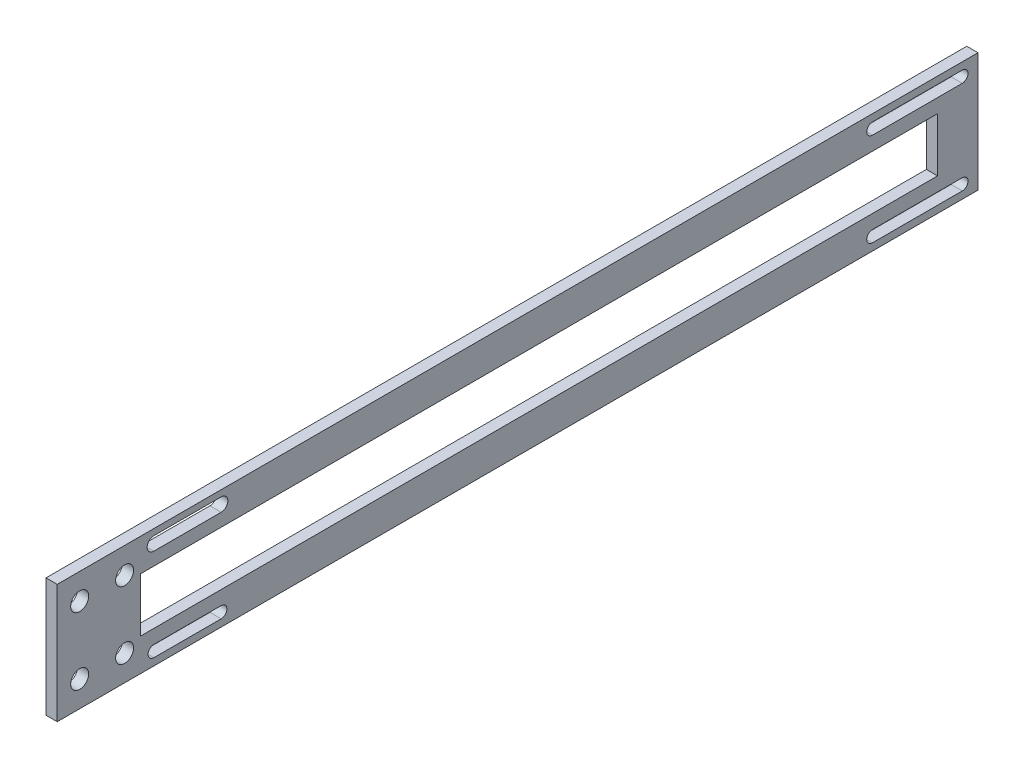
ISO-10303-21;
HEADER;
FILE_DESCRIPTION(('STEP AP214'),'2;1');
FILE_NAME('part.step','',(''),(''),'','','');
FILE_SCHEMA(('AUTOMOTIVE_DESIGN { 1 0 10303 214 1 1 1 1 }'));
ENDSEC;
DATA;
#1=APPLICATION_CONTEXT('core data for automotive mechanical design processes');
#2=APPLICATION_PROTOCOL_DEFINITION('international standard','automotive_design',2000,#1);
#3=PRODUCT_CONTEXT('',#1,'mechanical');
#4=PRODUCT('Part','Part','',(#3));
#5=PRODUCT_RELATED_PRODUCT_CATEGORY('part','',(#4));
#6=PRODUCT_DEFINITION_FORMATION('','',#4);
#7=PRODUCT_DEFINITION_CONTEXT('part definition',#1,'design');
#8=PRODUCT_DEFINITION('design','',#6,#7);
#9=PRODUCT_DEFINITION_SHAPE('','',#8);
#10=(LENGTH_UNIT() NAMED_UNIT(*) SI_UNIT(.MILLI.,.METRE.));
#11=(NAMED_UNIT(*) PLANE_ANGLE_UNIT() SI_UNIT($,.RADIAN.));
#12=(NAMED_UNIT(*) SI_UNIT($,.STERADIAN.) SOLID_ANGLE_UNIT());
#13=UNCERTAINTY_MEASURE_WITH_UNIT(LENGTH_MEASURE(1.E-05),#10,'distance_accuracy_value','');
#14=(GEOMETRIC_REPRESENTATION_CONTEXT(3) GLOBAL_UNCERTAINTY_ASSIGNED_CONTEXT((#13)) GLOBAL_UNIT_ASSIGNED_CONTEXT((#10,
#11,#12)) REPRESENTATION_CONTEXT('',''));
#15=CARTESIAN_POINT('',(0.,0.,0.));
#16=DIRECTION('',(0.,0.,1.));
#17=DIRECTION('',(1.,0.,0.));
#18=AXIS2_PLACEMENT_3D('',#15,#16,#17);
#19=CARTESIAN_POINT('',(-3.29113924050637,53.,-395.443037974684));
#20=DIRECTION('',(1.,0.,0.));
#21=DIRECTION('',(0.,0.,-1.));
#22=AXIS2_PLACEMENT_3D('',#19,#20,#21);
#23=PLANE('',#22);
#24=CARTESIAN_POINT('',(-3.29113924050632,41.5,-15.4430379746836));
#25=DIRECTION('',(1.,0.,0.));
#26=DIRECTION('',(0.,0.,-1.));
#27=AXIS2_PLACEMENT_3D('',#24,#25,#26);
#28=CIRCLE('',#27,4.);
#29=CARTESIAN_POINT('',(-3.29113924050632,41.5,-19.4430379746836));
#30=VERTEX_POINT('',#29);
#31=EDGE_CURVE('E510',#30,#30,#28,.F.);
#32=ORIENTED_EDGE('',*,*,#31,.F.);
#33=EDGE_LOOP('',(#32));
#34=FACE_BOUND('',#33,.T.);
#35=CARTESIAN_POINT('',(-3.29113924050632,11.5,-15.4430379746836));
#36=DIRECTION('',(1.,0.,0.));
#37=DIRECTION('',(0.,0.,-1.));
#38=AXIS2_PLACEMENT_3D('',#35,#36,#37);
#39=CIRCLE('',#38,4.);
#40=CARTESIAN_POINT('',(-3.29113924050632,11.5,-19.4430379746835));
#41=VERTEX_POINT('',#40);
#42=EDGE_CURVE('E516',#41,#41,#39,.F.);
#43=ORIENTED_EDGE('',*,*,#42,.F.);
#44=EDGE_LOOP('',(#43));
#45=FACE_BOUND('',#44,.T.);
#46=CARTESIAN_POINT('',(-3.29113924050632,11.5,4.55696202531645));
#47=DIRECTION('',(1.,0.,0.));
#48=DIRECTION('',(0.,0.,-1.));
#49=AXIS2_PLACEMENT_3D('',#46,#47,#48);
#50=CIRCLE('',#49,4.);
#51=CARTESIAN_POINT('',(-3.29113924050632,11.5,0.556962025316447));
#52=VERTEX_POINT('',#51);
#53=EDGE_CURVE('E522',#52,#52,#50,.F.);
#54=ORIENTED_EDGE('',*,*,#53,.F.);
#55=EDGE_LOOP('',(#54));
#56=FACE_BOUND('',#55,.T.);
#57=CARTESIAN_POINT('',(-3.29113924050632,41.5,4.55696202531645));
#58=DIRECTION('',(1.,0.,0.));
#59=DIRECTION('',(0.,0.,-1.));
#60=AXIS2_PLACEMENT_3D('',#57,#58,#59);
#61=CIRCLE('',#60,4.);
#62=CARTESIAN_POINT('',(-3.29113924050632,41.5,0.556962025316448));
#63=VERTEX_POINT('',#62);
#64=EDGE_CURVE('E514',#63,#63,#61,.F.);
#65=ORIENTED_EDGE('',*,*,#64,.F.);
#66=EDGE_LOOP('',(#65));
#67=FACE_BOUND('',#66,.T.);
#68=DIRECTION('',(0.,0.,-1.));
#69=VECTOR('',#68,1.);
#70=CARTESIAN_POINT('',(-3.29113924050632,38.5,-22.4430379746835));
#71=LINE('',#70,#69);
#72=CARTESIAN_POINT('',(-3.29113924050635,38.5,-22.4430379746835));
#73=VERTEX_POINT('',#72);
#74=CARTESIAN_POINT('',(-3.29113924050637,38.5,-377.443037974684));
#75=VERTEX_POINT('',#74);
#76=EDGE_CURVE('E211',#73,#75,#71,.T.);
#77=ORIENTED_EDGE('',*,*,#76,.F.);
#78=DIRECTION('',(0.,1.,0.));
#79=VECTOR('',#78,1.);
#80=CARTESIAN_POINT('',(-3.29113924050632,26.5,-22.4430379746835));
#81=LINE('',#80,#79);
#82=CARTESIAN_POINT('',(-3.29113924050632,14.5,-22.4430379746835));
#83=VERTEX_POINT('',#82);
#84=EDGE_CURVE('E195',#83,#73,#81,.T.);
#85=ORIENTED_EDGE('',*,*,#84,.F.);
#86=DIRECTION('',(0.,0.,1.));
#87=VECTOR('',#86,1.);
#88=CARTESIAN_POINT('',(-3.29113924050637,14.5,-377.443037974684));
#89=LINE('',#88,#87);
#90=CARTESIAN_POINT('',(-3.29113924050637,14.5,-377.443037974683));
#91=VERTEX_POINT('',#90);
#92=EDGE_CURVE('E203',#91,#83,#89,.T.);
#93=ORIENTED_EDGE('',*,*,#92,.F.);
#94=DIRECTION('',(0.,-1.,0.));
#95=VECTOR('',#94,1.);
#96=CARTESIAN_POINT('',(-3.29113924050637,38.5,-377.443037974684));
#97=LINE('',#96,#95);
#98=EDGE_CURVE('E47',#75,#91,#97,.T.);
#99=ORIENTED_EDGE('',*,*,#98,.F.);
#100=EDGE_LOOP('',(#77,#85,#93,#99));
#101=FACE_BOUND('',#100,.T.);
#102=DIRECTION('',(0.,0.,1.));
#103=VECTOR('',#102,1.);
#104=CARTESIAN_POINT('',(-3.29113924050633,3.2,-58.4430379746835));
#105=LINE('',#104,#103);
#106=CARTESIAN_POINT('',(-3.29113924050633,3.2,-58.4430379746835));
#107=VERTEX_POINT('',#106);
#108=CARTESIAN_POINT('',(-3.29113924050633,3.2,-28.4430379746835));
#109=VERTEX_POINT('',#108);
#110=EDGE_CURVE('E231',#107,#109,#105,.T.);
#111=ORIENTED_EDGE('',*,*,#110,.F.);
#112=CARTESIAN_POINT('',(-3.29113924050633,5.75,-58.4430379746835));
#113=DIRECTION('',(1.,0.,0.));
#114=DIRECTION('',(0.,0.,-1.));
#115=AXIS2_PLACEMENT_3D('',#112,#113,#114);
#116=CIRCLE('',#115,2.55);
#117=CARTESIAN_POINT('',(-3.29113924050633,8.3,-58.4430379746835));
#118=VERTEX_POINT('',#117);
#119=EDGE_CURVE('E235',#118,#107,#116,.F.);
#120=ORIENTED_EDGE('',*,*,#119,.F.);
#121=DIRECTION('',(0.,0.,-1.));
#122=VECTOR('',#121,1.);
#123=CARTESIAN_POINT('',(-3.29113924050633,8.3,-58.4430379746835));
#124=LINE('',#123,#122);
#125=CARTESIAN_POINT('',(-3.29113924050633,8.3,-28.4430379746835));
#126=VERTEX_POINT('',#125);
#127=EDGE_CURVE('E252',#126,#118,#124,.T.);
#128=ORIENTED_EDGE('',*,*,#127,.F.);
#129=CARTESIAN_POINT('',(-3.29113924050633,5.74999999999999,-28.4430379746835));
#130=DIRECTION('',(1.,0.,0.));
#131=DIRECTION('',(0.,0.,-1.));
#132=AXIS2_PLACEMENT_3D('',#129,#130,#131);
#133=CIRCLE('',#132,2.55);
#134=EDGE_CURVE('E229',#109,#126,#133,.F.);
#135=ORIENTED_EDGE('',*,*,#134,.F.);
#136=EDGE_LOOP('',(#111,#120,#128,#135));
#137=FACE_BOUND('',#136,.T.);
#138=DIRECTION('',(0.,0.,-1.));
#139=VECTOR('',#138,1.);
#140=CARTESIAN_POINT('',(-3.29113924050636,49.8,-348.443037974684));
#141=LINE('',#140,#139);
#142=CARTESIAN_POINT('',(-3.29113924050637,49.8,-348.443037974684));
#143=VERTEX_POINT('',#142);
#144=CARTESIAN_POINT('',(-3.29113924050637,49.8,-388.443037974683));
#145=VERTEX_POINT('',#144);
#146=EDGE_CURVE('E264',#143,#145,#141,.T.);
#147=ORIENTED_EDGE('',*,*,#146,.F.);
#148=CARTESIAN_POINT('',(-3.29113924050636,47.25,-348.443037974684));
#149=DIRECTION('',(1.,0.,0.));
#150=DIRECTION('',(0.,0.,-1.));
#151=AXIS2_PLACEMENT_3D('',#148,#149,#150);
#152=CIRCLE('',#151,2.55);
#153=CARTESIAN_POINT('',(-3.29113924050636,44.7,-348.443037974684));
#154=VERTEX_POINT('',#153);
#155=EDGE_CURVE('E268',#154,#143,#152,.F.);
#156=ORIENTED_EDGE('',*,*,#155,.F.);
#157=DIRECTION('',(0.,0.,1.));
#158=VECTOR('',#157,1.);
#159=CARTESIAN_POINT('',(-3.29113924050636,44.7,-348.443037974684));
#160=LINE('',#159,#158);
#161=CARTESIAN_POINT('',(-3.29113924050637,44.7,-388.443037974683));
#162=VERTEX_POINT('',#161);
#163=EDGE_CURVE('E232',#162,#154,#160,.T.);
#164=ORIENTED_EDGE('',*,*,#163,.F.);
#165=CARTESIAN_POINT('',(-3.29113924050637,47.25,-388.443037974683));
#166=DIRECTION('',(1.,0.,0.));
#167=DIRECTION('',(0.,0.,-1.));
#168=AXIS2_PLACEMENT_3D('',#165,#166,#167);
#169=CIRCLE('',#168,2.55);
#170=EDGE_CURVE('E262',#145,#162,#169,.F.);
#171=ORIENTED_EDGE('',*,*,#170,.F.);
#172=EDGE_LOOP('',(#147,#156,#164,#171));
#173=FACE_BOUND('',#172,.T.);
#174=DIRECTION('',(0.,0.,-1.));
#175=VECTOR('',#174,1.);
#176=CARTESIAN_POINT('',(-3.29113924050636,8.3,-348.443037974684));
#177=LINE('',#176,#175);
#178=CARTESIAN_POINT('',(-3.29113924050637,8.3,-348.443037974684));
#179=VERTEX_POINT('',#178);
#180=CARTESIAN_POINT('',(-3.29113924050637,8.3,-388.443037974683));
#181=VERTEX_POINT('',#180);
#182=EDGE_CURVE('E294',#179,#181,#177,.T.);
#183=ORIENTED_EDGE('',*,*,#182,.F.);
#184=CARTESIAN_POINT('',(-3.29113924050636,5.75,-348.443037974684));
#185=DIRECTION('',(1.,0.,0.));
#186=DIRECTION('',(0.,0.,-1.));
#187=AXIS2_PLACEMENT_3D('',#184,#185,#186);
#188=CIRCLE('',#187,2.55);
#189=CARTESIAN_POINT('',(-3.29113924050636,3.2,-348.443037974684));
#190=VERTEX_POINT('',#189);
#191=EDGE_CURVE('E297',#190,#179,#188,.F.);
#192=ORIENTED_EDGE('',*,*,#191,.F.);
#193=DIRECTION('',(0.,0.,1.));
#194=VECTOR('',#193,1.);
#195=CARTESIAN_POINT('',(-3.29113924050636,3.2,-348.443037974684));
#196=LINE('',#195,#194);
#197=CARTESIAN_POINT('',(-3.29113924050637,3.19999999999999,-388.443037974683));
#198=VERTEX_POINT('',#197);
#199=EDGE_CURVE('E265',#198,#190,#196,.T.);
#200=ORIENTED_EDGE('',*,*,#199,.F.);
#201=CARTESIAN_POINT('',(-3.29113924050637,5.75,-388.443037974683));
#202=DIRECTION('',(1.,0.,0.));
#203=DIRECTION('',(0.,0.,-1.));
#204=AXIS2_PLACEMENT_3D('',#201,#202,#203);
#205=CIRCLE('',#204,2.55);
#206=EDGE_CURVE('E206',#181,#198,#205,.F.);
#207=ORIENTED_EDGE('',*,*,#206,.F.);
#208=EDGE_LOOP('',(#183,#192,#200,#207));
#209=FACE_BOUND('',#208,.T.);
#210=DIRECTION('',(0.,0.,1.));
#211=VECTOR('',#210,1.);
#212=CARTESIAN_POINT('',(-3.29113924050633,44.2805218850566,-58.4430379746835));
#213=LINE('',#212,#211);
#214=CARTESIAN_POINT('',(-3.29113924050633,44.2805218850566,-58.4430379746835));
#215=VERTEX_POINT('',#214);
#216=CARTESIAN_POINT('',(-3.29113924050633,44.2805218850566,-28.4430379746835));
#217=VERTEX_POINT('',#216);
#218=EDGE_CURVE('E323',#215,#217,#213,.T.);
#219=ORIENTED_EDGE('',*,*,#218,.F.);
#220=CARTESIAN_POINT('',(-3.29113924050633,47.25,-58.4430379746835));
#221=DIRECTION('',(1.,0.,0.));
#222=DIRECTION('',(0.,0.,-1.));
#223=AXIS2_PLACEMENT_3D('',#220,#221,#222);
#224=CIRCLE('',#223,2.9694781149434);
#225=CARTESIAN_POINT('',(-3.29113924050633,50.2194781149434,-58.4430379746835));
#226=VERTEX_POINT('',#225);
#227=EDGE_CURVE('E326',#226,#215,#224,.F.);
#228=ORIENTED_EDGE('',*,*,#227,.F.);
#229=DIRECTION('',(0.,0.,-1.));
#230=VECTOR('',#229,1.);
#231=CARTESIAN_POINT('',(-3.29113924050633,50.2194781149434,-58.4430379746835));
#232=LINE('',#231,#230);
#233=CARTESIAN_POINT('',(-3.29113924050633,50.2194781149434,-28.4430379746835));
#234=VERTEX_POINT('',#233);
#235=EDGE_CURVE('E343',#234,#226,#232,.T.);
#236=ORIENTED_EDGE('',*,*,#235,.F.);
#237=CARTESIAN_POINT('',(-3.29113924050633,47.25,-28.4430379746835));
#238=DIRECTION('',(1.,0.,0.));
#239=DIRECTION('',(0.,0.,-1.));
#240=AXIS2_PLACEMENT_3D('',#237,#238,#239);
#241=CIRCLE('',#240,2.96947811494342);
#242=EDGE_CURVE('E261',#217,#234,#241,.F.);
#243=ORIENTED_EDGE('',*,*,#242,.F.);
#244=EDGE_LOOP('',(#219,#228,#236,#243));
#245=FACE_BOUND('',#244,.T.);
#246=DIRECTION('',(0.,0.,1.));
#247=VECTOR('',#246,1.);
#248=CARTESIAN_POINT('',(-3.29113924050637,0.,-395.443037974684));
#249=LINE('',#248,#247);
#250=CARTESIAN_POINT('',(-3.29113924050637,0.,-395.443037974684));
#251=VERTEX_POINT('',#250);
#252=CARTESIAN_POINT('',(-3.29113924050632,0.,14.5569620253164));
#253=VERTEX_POINT('',#252);
#254=EDGE_CURVE('E352',#251,#253,#249,.T.);
#255=ORIENTED_EDGE('',*,*,#254,.T.);
#256=DIRECTION('',(0.,-1.,0.));
#257=VECTOR('',#256,1.);
#258=CARTESIAN_POINT('',(-3.29113924050632,53.,14.5569620253164));
#259=LINE('',#258,#257);
#260=CARTESIAN_POINT('',(-3.29113924050632,53.,14.5569620253164));
#261=VERTEX_POINT('',#260);
#262=EDGE_CURVE('E11',#261,#253,#259,.T.);
#263=ORIENTED_EDGE('',*,*,#262,.F.);
#264=DIRECTION('',(0.,0.,1.));
#265=VECTOR('',#264,1.);
#266=CARTESIAN_POINT('',(-3.29113924050637,53.,-395.443037974684));
#267=LINE('',#266,#265);
#268=CARTESIAN_POINT('',(-3.29113924050637,53.,-395.443037974684));
#269=VERTEX_POINT('',#268);
#270=EDGE_CURVE('E353',#269,#261,#267,.T.);
#271=ORIENTED_EDGE('',*,*,#270,.F.);
#272=DIRECTION('',(0.,-1.,0.));
#273=VECTOR('',#272,1.);
#274=CARTESIAN_POINT('',(-3.29113924050637,53.,-395.443037974684));
#275=LINE('',#274,#273);
#276=EDGE_CURVE('E363',#269,#251,#275,.T.);
#277=ORIENTED_EDGE('',*,*,#276,.T.);
#278=EDGE_LOOP('',(#255,#263,#271,#277));
#279=FACE_BOUND('',#278,.T.);
#280=ADVANCED_FACE('F33',(#34,#45,#56,#67,#101,#137,#173,#209,#245,#279),#23,.F.);
#281=CARTESIAN_POINT('',(-3.29113924050632,53.,14.5569620253164));
#282=DIRECTION('',(0.,0.,-1.));
#283=DIRECTION('',(-1.,0.,0.));
#284=AXIS2_PLACEMENT_3D('',#281,#282,#283);
#285=PLANE('',#284);
#286=DIRECTION('',(1.,0.,0.));
#287=VECTOR('',#286,1.);
#288=CARTESIAN_POINT('',(-3.29113924050632,0.,14.5569620253164));
#289=LINE('',#288,#287);
#290=CARTESIAN_POINT('',(1.70886075949368,0.,14.5569620253164));
#291=VERTEX_POINT('',#290);
#292=EDGE_CURVE('E366',#253,#291,#289,.T.);
#293=ORIENTED_EDGE('',*,*,#292,.T.);
#294=DIRECTION('',(0.,-1.,0.));
#295=VECTOR('',#294,1.);
#296=CARTESIAN_POINT('',(1.70886075949368,53.,14.5569620253164));
#297=LINE('',#296,#295);
#298=CARTESIAN_POINT('',(1.70886075949368,53.,14.5569620253164));
#299=VERTEX_POINT('',#298);
#300=EDGE_CURVE('E40',#299,#291,#297,.T.);
#301=ORIENTED_EDGE('',*,*,#300,.F.);
#302=DIRECTION('',(1.,0.,0.));
#303=VECTOR('',#302,1.);
#304=CARTESIAN_POINT('',(-3.29113924050632,53.,14.5569620253164));
#305=LINE('',#304,#303);
#306=EDGE_CURVE('E356',#261,#299,#305,.T.);
#307=ORIENTED_EDGE('',*,*,#306,.F.);
#308=ORIENTED_EDGE('',*,*,#262,.T.);
#309=EDGE_LOOP('',(#293,#301,#307,#308));
#310=FACE_BOUND('',#309,.T.);
#311=ADVANCED_FACE('F396',(#310),#285,.F.);
#312=CARTESIAN_POINT('',(1.70886075949363,53.,-395.443037974684));
#313=DIRECTION('',(-1.,0.,0.));
#314=DIRECTION('',(0.,0.,1.));
#315=AXIS2_PLACEMENT_3D('',#312,#313,#314);
#316=PLANE('',#315);
#317=CARTESIAN_POINT('',(1.70886075949368,41.5,-15.4430379746836));
#318=DIRECTION('',(1.,0.,0.));
#319=DIRECTION('',(0.,0.,-1.));
#320=AXIS2_PLACEMENT_3D('',#317,#318,#319);
#321=CIRCLE('',#320,4.);
#322=CARTESIAN_POINT('',(1.70886075949368,41.5,-19.4430379746836));
#323=VERTEX_POINT('',#322);
#324=EDGE_CURVE('E507',#323,#323,#321,.T.);
#325=ORIENTED_EDGE('',*,*,#324,.F.);
#326=EDGE_LOOP('',(#325));
#327=FACE_BOUND('',#326,.T.);
#328=CARTESIAN_POINT('',(1.70886075949368,11.5,-15.4430379746836));
#329=DIRECTION('',(1.,0.,0.));
#330=DIRECTION('',(0.,0.,-1.));
#331=AXIS2_PLACEMENT_3D('',#328,#329,#330);
#332=CIRCLE('',#331,4.);
#333=CARTESIAN_POINT('',(1.70886075949368,11.5,-19.4430379746835));
#334=VERTEX_POINT('',#333);
#335=EDGE_CURVE('E519',#334,#334,#332,.T.);
#336=ORIENTED_EDGE('',*,*,#335,.F.);
#337=EDGE_LOOP('',(#336));
#338=FACE_BOUND('',#337,.T.);
#339=CARTESIAN_POINT('',(1.70886075949368,11.5,4.55696202531645));
#340=DIRECTION('',(1.,0.,0.));
#341=DIRECTION('',(0.,0.,-1.));
#342=AXIS2_PLACEMENT_3D('',#339,#340,#341);
#343=CIRCLE('',#342,4.);
#344=CARTESIAN_POINT('',(1.70886075949368,11.5,0.556962025316446));
#345=VERTEX_POINT('',#344);
#346=EDGE_CURVE('E525',#345,#345,#343,.T.);
#347=ORIENTED_EDGE('',*,*,#346,.F.);
#348=EDGE_LOOP('',(#347));
#349=FACE_BOUND('',#348,.T.);
#350=CARTESIAN_POINT('',(1.70886075949368,41.5,4.55696202531645));
#351=DIRECTION('',(1.,0.,0.));
#352=DIRECTION('',(0.,0.,-1.));
#353=AXIS2_PLACEMENT_3D('',#350,#351,#352);
#354=CIRCLE('',#353,4.);
#355=CARTESIAN_POINT('',(1.70886075949368,41.5,0.556962025316447));
#356=VERTEX_POINT('',#355);
#357=EDGE_CURVE('E511',#356,#356,#354,.T.);
#358=ORIENTED_EDGE('',*,*,#357,.F.);
#359=EDGE_LOOP('',(#358));
#360=FACE_BOUND('',#359,.T.);
#361=DIRECTION('',(0.,0.,-1.));
#362=VECTOR('',#361,1.);
#363=CARTESIAN_POINT('',(1.70886075949363,14.5,-377.443037974684));
#364=LINE('',#363,#362);
#365=CARTESIAN_POINT('',(1.70886075949367,14.5,-22.4430379746835));
#366=VERTEX_POINT('',#365);
#367=CARTESIAN_POINT('',(1.70886075949363,14.5,-377.443037974684));
#368=VERTEX_POINT('',#367);
#369=EDGE_CURVE('E212',#366,#368,#364,.T.);
#370=ORIENTED_EDGE('',*,*,#369,.F.);
#371=DIRECTION('',(0.,-1.,0.));
#372=VECTOR('',#371,1.);
#373=CARTESIAN_POINT('',(1.70886075949367,26.5,-22.4430379746835));
#374=LINE('',#373,#372);
#375=CARTESIAN_POINT('',(1.70886075949367,38.5,-22.4430379746835));
#376=VERTEX_POINT('',#375);
#377=EDGE_CURVE('E55',#376,#366,#374,.T.);
#378=ORIENTED_EDGE('',*,*,#377,.F.);
#379=DIRECTION('',(0.,0.,1.));
#380=VECTOR('',#379,1.);
#381=CARTESIAN_POINT('',(1.70886075949367,38.5,-22.4430379746835));
#382=LINE('',#381,#380);
#383=CARTESIAN_POINT('',(1.70886075949363,38.5,-377.443037974684));
#384=VERTEX_POINT('',#383);
#385=EDGE_CURVE('E221',#384,#376,#382,.T.);
#386=ORIENTED_EDGE('',*,*,#385,.F.);
#387=DIRECTION('',(0.,1.,0.));
#388=VECTOR('',#387,1.);
#389=CARTESIAN_POINT('',(1.70886075949363,38.5,-377.443037974684));
#390=LINE('',#389,#388);
#391=EDGE_CURVE('E214',#368,#384,#390,.T.);
#392=ORIENTED_EDGE('',*,*,#391,.F.);
#393=EDGE_LOOP('',(#370,#378,#386,#392));
#394=FACE_BOUND('',#393,.T.);
#395=DIRECTION('',(0.,0.,1.));
#396=VECTOR('',#395,1.);
#397=CARTESIAN_POINT('',(1.70886075949367,8.3,-58.4430379746835));
#398=LINE('',#397,#396);
#399=CARTESIAN_POINT('',(1.70886075949367,8.3,-58.4430379746836));
#400=VERTEX_POINT('',#399);
#401=CARTESIAN_POINT('',(1.70886075949367,8.29999999999999,-28.4430379746835));
#402=VERTEX_POINT('',#401);
#403=EDGE_CURVE('E240',#400,#402,#398,.T.);
#404=ORIENTED_EDGE('',*,*,#403,.F.);
#405=CARTESIAN_POINT('',(1.70886075949367,5.75,-58.4430379746835));
#406=DIRECTION('',(1.,0.,0.));
#407=DIRECTION('',(0.,0.,-1.));
#408=AXIS2_PLACEMENT_3D('',#405,#406,#407);
#409=CIRCLE('',#408,2.55);
#410=CARTESIAN_POINT('',(1.70886075949367,3.2,-58.4430379746835));
#411=VERTEX_POINT('',#410);
#412=EDGE_CURVE('E238',#411,#400,#409,.T.);
#413=ORIENTED_EDGE('',*,*,#412,.F.);
#414=DIRECTION('',(0.,0.,-1.));
#415=VECTOR('',#414,1.);
#416=CARTESIAN_POINT('',(1.70886075949367,3.2,-58.4430379746835));
#417=LINE('',#416,#415);
#418=CARTESIAN_POINT('',(1.70886075949367,3.2,-28.4430379746835));
#419=VERTEX_POINT('',#418);
#420=EDGE_CURVE('E246',#419,#411,#417,.T.);
#421=ORIENTED_EDGE('',*,*,#420,.F.);
#422=CARTESIAN_POINT('',(1.70886075949367,5.74999999999999,-28.4430379746835));
#423=DIRECTION('',(1.,0.,0.));
#424=DIRECTION('',(0.,0.,-1.));
#425=AXIS2_PLACEMENT_3D('',#422,#423,#424);
#426=CIRCLE('',#425,2.55);
#427=EDGE_CURVE('E243',#402,#419,#426,.T.);
#428=ORIENTED_EDGE('',*,*,#427,.F.);
#429=EDGE_LOOP('',(#404,#413,#421,#428));
#430=FACE_BOUND('',#429,.T.);
#431=DIRECTION('',(0.,0.,-1.));
#432=VECTOR('',#431,1.);
#433=CARTESIAN_POINT('',(1.70886075949364,44.7,-348.443037974684));
#434=LINE('',#433,#432);
#435=CARTESIAN_POINT('',(1.70886075949363,44.7,-348.443037974684));
#436=VERTEX_POINT('',#435);
#437=CARTESIAN_POINT('',(1.70886075949363,44.7,-388.443037974683));
#438=VERTEX_POINT('',#437);
#439=EDGE_CURVE('E273',#436,#438,#434,.T.);
#440=ORIENTED_EDGE('',*,*,#439,.F.);
#441=CARTESIAN_POINT('',(1.70886075949364,47.25,-348.443037974684));
#442=DIRECTION('',(1.,0.,0.));
#443=DIRECTION('',(0.,0.,-1.));
#444=AXIS2_PLACEMENT_3D('',#441,#442,#443);
#445=CIRCLE('',#444,2.55);
#446=CARTESIAN_POINT('',(1.70886075949364,49.8,-348.443037974684));
#447=VERTEX_POINT('',#446);
#448=EDGE_CURVE('E271',#447,#436,#445,.T.);
#449=ORIENTED_EDGE('',*,*,#448,.F.);
#450=DIRECTION('',(0.,0.,1.));
#451=VECTOR('',#450,1.);
#452=CARTESIAN_POINT('',(1.70886075949364,49.8,-348.443037974684));
#453=LINE('',#452,#451);
#454=CARTESIAN_POINT('',(1.70886075949363,49.8,-388.443037974683));
#455=VERTEX_POINT('',#454);
#456=EDGE_CURVE('E279',#455,#447,#453,.T.);
#457=ORIENTED_EDGE('',*,*,#456,.F.);
#458=CARTESIAN_POINT('',(1.70886075949363,47.25,-388.443037974683));
#459=DIRECTION('',(1.,0.,0.));
#460=DIRECTION('',(0.,0.,-1.));
#461=AXIS2_PLACEMENT_3D('',#458,#459,#460);
#462=CIRCLE('',#461,2.55);
#463=EDGE_CURVE('E276',#438,#455,#462,.T.);
#464=ORIENTED_EDGE('',*,*,#463,.F.);
#465=EDGE_LOOP('',(#440,#449,#457,#464));
#466=FACE_BOUND('',#465,.T.);
#467=DIRECTION('',(0.,0.,-1.));
#468=VECTOR('',#467,1.);
#469=CARTESIAN_POINT('',(1.70886075949364,3.2,-348.443037974684));
#470=LINE('',#469,#468);
#471=CARTESIAN_POINT('',(1.70886075949363,3.19999999999999,-348.443037974684));
#472=VERTEX_POINT('',#471);
#473=CARTESIAN_POINT('',(1.70886075949363,3.2,-388.443037974683));
#474=VERTEX_POINT('',#473);
#475=EDGE_CURVE('E302',#472,#474,#470,.T.);
#476=ORIENTED_EDGE('',*,*,#475,.F.);
#477=CARTESIAN_POINT('',(1.70886075949364,5.75,-348.443037974684));
#478=DIRECTION('',(1.,0.,0.));
#479=DIRECTION('',(0.,0.,-1.));
#480=AXIS2_PLACEMENT_3D('',#477,#478,#479);
#481=CIRCLE('',#480,2.55);
#482=CARTESIAN_POINT('',(1.70886075949364,8.3,-348.443037974684));
#483=VERTEX_POINT('',#482);
#484=EDGE_CURVE('E300',#483,#472,#481,.T.);
#485=ORIENTED_EDGE('',*,*,#484,.F.);
#486=DIRECTION('',(0.,0.,1.));
#487=VECTOR('',#486,1.);
#488=CARTESIAN_POINT('',(1.70886075949364,8.3,-348.443037974684));
#489=LINE('',#488,#487);
#490=CARTESIAN_POINT('',(1.70886075949363,8.3,-388.443037974683));
#491=VERTEX_POINT('',#490);
#492=EDGE_CURVE('E308',#491,#483,#489,.T.);
#493=ORIENTED_EDGE('',*,*,#492,.F.);
#494=CARTESIAN_POINT('',(1.70886075949363,5.75,-388.443037974683));
#495=DIRECTION('',(1.,0.,0.));
#496=DIRECTION('',(0.,0.,-1.));
#497=AXIS2_PLACEMENT_3D('',#494,#495,#496);
#498=CIRCLE('',#497,2.55);
#499=EDGE_CURVE('E305',#474,#491,#498,.T.);
#500=ORIENTED_EDGE('',*,*,#499,.F.);
#501=EDGE_LOOP('',(#476,#485,#493,#500));
#502=FACE_BOUND('',#501,.T.);
#503=DIRECTION('',(0.,0.,1.));
#504=VECTOR('',#503,1.);
#505=CARTESIAN_POINT('',(1.70886075949367,50.2194781149434,-58.4430379746835));
#506=LINE('',#505,#504);
#507=CARTESIAN_POINT('',(1.70886075949367,50.2194781149434,-58.4430379746836));
#508=VERTEX_POINT('',#507);
#509=CARTESIAN_POINT('',(1.70886075949367,50.2194781149434,-28.4430379746835));
#510=VERTEX_POINT('',#509);
#511=EDGE_CURVE('E331',#508,#510,#506,.T.);
#512=ORIENTED_EDGE('',*,*,#511,.F.);
#513=CARTESIAN_POINT('',(1.70886075949367,47.25,-58.4430379746835));
#514=DIRECTION('',(1.,0.,0.));
#515=DIRECTION('',(0.,0.,-1.));
#516=AXIS2_PLACEMENT_3D('',#513,#514,#515);
#517=CIRCLE('',#516,2.9694781149434);
#518=CARTESIAN_POINT('',(1.70886075949367,44.2805218850566,-58.4430379746835));
#519=VERTEX_POINT('',#518);
#520=EDGE_CURVE('E329',#519,#508,#517,.T.);
#521=ORIENTED_EDGE('',*,*,#520,.F.);
#522=DIRECTION('',(0.,0.,-1.));
#523=VECTOR('',#522,1.);
#524=CARTESIAN_POINT('',(1.70886075949367,44.2805218850566,-58.4430379746835));
#525=LINE('',#524,#523);
#526=CARTESIAN_POINT('',(1.70886075949367,44.2805218850566,-28.4430379746835));
#527=VERTEX_POINT('',#526);
#528=EDGE_CURVE('E337',#527,#519,#525,.T.);
#529=ORIENTED_EDGE('',*,*,#528,.F.);
#530=CARTESIAN_POINT('',(1.70886075949367,47.25,-28.4430379746835));
#531=DIRECTION('',(1.,0.,0.));
#532=DIRECTION('',(0.,0.,-1.));
#533=AXIS2_PLACEMENT_3D('',#530,#531,#532);
#534=CIRCLE('',#533,2.96947811494342);
#535=EDGE_CURVE('E334',#510,#527,#534,.T.);
#536=ORIENTED_EDGE('',*,*,#535,.F.);
#537=EDGE_LOOP('',(#512,#521,#529,#536));
#538=FACE_BOUND('',#537,.T.);
#539=DIRECTION('',(0.,0.,-1.));
#540=VECTOR('',#539,1.);
#541=CARTESIAN_POINT('',(1.70886075949363,0.,-395.443037974684));
#542=LINE('',#541,#540);
#543=CARTESIAN_POINT('',(1.70886075949363,0.,-395.443037974684));
#544=VERTEX_POINT('',#543);
#545=EDGE_CURVE('E368',#291,#544,#542,.T.);
#546=ORIENTED_EDGE('',*,*,#545,.T.);
#547=DIRECTION('',(0.,-1.,0.));
#548=VECTOR('',#547,1.);
#549=CARTESIAN_POINT('',(1.70886075949363,53.,-395.443037974684));
#550=LINE('',#549,#548);
#551=CARTESIAN_POINT('',(1.70886075949363,53.,-395.443037974684));
#552=VERTEX_POINT('',#551);
#553=EDGE_CURVE('E373',#552,#544,#550,.T.);
#554=ORIENTED_EDGE('',*,*,#553,.F.);
#555=DIRECTION('',(0.,0.,-1.));
#556=VECTOR('',#555,1.);
#557=CARTESIAN_POINT('',(1.70886075949363,53.,-395.443037974684));
#558=LINE('',#557,#556);
#559=EDGE_CURVE('E359',#299,#552,#558,.T.);
#560=ORIENTED_EDGE('',*,*,#559,.F.);
#561=ORIENTED_EDGE('',*,*,#300,.T.);
#562=EDGE_LOOP('',(#546,#554,#560,#561));
#563=FACE_BOUND('',#562,.T.);
#564=ADVANCED_FACE('F380',(#327,#338,#349,#360,#394,#430,#466,#502,#538,#563),#316,.F.);
#565=CARTESIAN_POINT('',(-3.29113924050637,53.,-395.443037974684));
#566=DIRECTION('',(0.,0.,1.));
#567=DIRECTION('',(1.,0.,0.));
#568=AXIS2_PLACEMENT_3D('',#565,#566,#567);
#569=PLANE('',#568);
#570=DIRECTION('',(-1.,0.,0.));
#571=VECTOR('',#570,1.);
#572=CARTESIAN_POINT('',(-3.29113924050637,0.,-395.443037974684));
#573=LINE('',#572,#571);
#574=EDGE_CURVE('E357',#544,#251,#573,.T.);
#575=ORIENTED_EDGE('',*,*,#574,.T.);
#576=ORIENTED_EDGE('',*,*,#276,.F.);
#577=DIRECTION('',(-1.,0.,0.));
#578=VECTOR('',#577,1.);
#579=CARTESIAN_POINT('',(-3.29113924050637,53.,-395.443037974684));
#580=LINE('',#579,#578);
#581=EDGE_CURVE('E361',#552,#269,#580,.T.);
#582=ORIENTED_EDGE('',*,*,#581,.F.);
#583=ORIENTED_EDGE('',*,*,#553,.T.);
#584=EDGE_LOOP('',(#575,#576,#582,#583));
#585=FACE_BOUND('',#584,.T.);
#586=ADVANCED_FACE('F389',(#585),#569,.F.);
#587=CARTESIAN_POINT('',(0.,53.,0.));
#588=DIRECTION('',(0.,1.,0.));
#589=DIRECTION('',(0.,0.,1.));
#590=AXIS2_PLACEMENT_3D('',#587,#588,#589);
#591=PLANE('',#590);
#592=ORIENTED_EDGE('',*,*,#270,.T.);
#593=ORIENTED_EDGE('',*,*,#306,.T.);
#594=ORIENTED_EDGE('',*,*,#559,.T.);
#595=ORIENTED_EDGE('',*,*,#581,.T.);
#596=EDGE_LOOP('',(#592,#593,#594,#595));
#597=FACE_BOUND('',#596,.T.);
#598=ADVANCED_FACE('F395',(#597),#591,.T.);
#599=CARTESIAN_POINT('',(0.,0.,0.));
#600=DIRECTION('',(0.,1.,0.));
#601=DIRECTION('',(0.,0.,1.));
#602=AXIS2_PLACEMENT_3D('',#599,#600,#601);
#603=PLANE('',#602);
#604=ORIENTED_EDGE('',*,*,#254,.F.);
#605=ORIENTED_EDGE('',*,*,#574,.F.);
#606=ORIENTED_EDGE('',*,*,#545,.F.);
#607=ORIENTED_EDGE('',*,*,#292,.F.);
#608=EDGE_LOOP('',(#604,#605,#606,#607));
#609=FACE_BOUND('',#608,.T.);
#610=ADVANCED_FACE('F386',(#609),#603,.F.);
#611=CARTESIAN_POINT('',(-3.29213924050638,47.25,-58.4430379746835));
#612=DIRECTION('',(1.,0.,0.));
#613=DIRECTION('',(0.,0.,-1.));
#614=AXIS2_PLACEMENT_3D('',#611,#612,#613);
#615=CYLINDRICAL_SURFACE('',#614,2.9694781149434);
#616=ORIENTED_EDGE('',*,*,#227,.T.);
#617=DIRECTION('',(1.,0.,0.));
#618=VECTOR('',#617,1.);
#619=CARTESIAN_POINT('',(-3.29213924050638,44.2805218850566,-58.4430379746835));
#620=LINE('',#619,#618);
#621=EDGE_CURVE('E341',#215,#519,#620,.T.);
#622=ORIENTED_EDGE('',*,*,#621,.T.);
#623=ORIENTED_EDGE('',*,*,#520,.T.);
#624=DIRECTION('',(1.,0.,0.));
#625=VECTOR('',#624,1.);
#626=CARTESIAN_POINT('',(-3.29213924050638,50.2194781149434,-58.4430379746835));
#627=LINE('',#626,#625);
#628=EDGE_CURVE('E340',#226,#508,#627,.T.);
#629=ORIENTED_EDGE('',*,*,#628,.F.);
#630=EDGE_LOOP('',(#616,#622,#623,#629));
#631=FACE_BOUND('',#630,.T.);
#632=ADVANCED_FACE('F410',(#631),#615,.F.);
#633=CARTESIAN_POINT('',(-3.29213924050638,44.2805218850566,-58.4430379746835));
#634=DIRECTION('',(0.,-1.,0.));
#635=DIRECTION('',(0.,0.,-1.));
#636=AXIS2_PLACEMENT_3D('',#633,#634,#635);
#637=PLANE('',#636);
#638=ORIENTED_EDGE('',*,*,#218,.T.);
#639=DIRECTION('',(1.,0.,0.));
#640=VECTOR('',#639,1.);
#641=CARTESIAN_POINT('',(-3.29213924050638,44.2805218850566,-28.4430379746835));
#642=LINE('',#641,#640);
#643=EDGE_CURVE('E344',#217,#527,#642,.T.);
#644=ORIENTED_EDGE('',*,*,#643,.T.);
#645=ORIENTED_EDGE('',*,*,#528,.T.);
#646=ORIENTED_EDGE('',*,*,#621,.F.);
#647=EDGE_LOOP('',(#638,#644,#645,#646));
#648=FACE_BOUND('',#647,.T.);
#649=ADVANCED_FACE('F415',(#648),#637,.F.);
#650=CARTESIAN_POINT('',(-3.29213924050638,47.25,-28.4430379746835));
#651=DIRECTION('',(1.,0.,0.));
#652=DIRECTION('',(0.,0.,-1.));
#653=AXIS2_PLACEMENT_3D('',#650,#651,#652);
#654=CYLINDRICAL_SURFACE('',#653,2.96947811494342);
#655=ORIENTED_EDGE('',*,*,#242,.T.);
#656=DIRECTION('',(1.,0.,0.));
#657=VECTOR('',#656,1.);
#658=CARTESIAN_POINT('',(-3.29213924050638,50.2194781149434,-28.4430379746835));
#659=LINE('',#658,#657);
#660=EDGE_CURVE('E346',#234,#510,#659,.T.);
#661=ORIENTED_EDGE('',*,*,#660,.T.);
#662=ORIENTED_EDGE('',*,*,#535,.T.);
#663=ORIENTED_EDGE('',*,*,#643,.F.);
#664=EDGE_LOOP('',(#655,#661,#662,#663));
#665=FACE_BOUND('',#664,.T.);
#666=ADVANCED_FACE('F421',(#665),#654,.F.);
#667=CARTESIAN_POINT('',(-3.29213924050638,50.2194781149434,-58.4430379746835));
#668=DIRECTION('',(0.,1.,0.));
#669=DIRECTION('',(0.,0.,1.));
#670=AXIS2_PLACEMENT_3D('',#667,#668,#669);
#671=PLANE('',#670);
#672=ORIENTED_EDGE('',*,*,#235,.T.);
#673=ORIENTED_EDGE('',*,*,#628,.T.);
#674=ORIENTED_EDGE('',*,*,#511,.T.);
#675=ORIENTED_EDGE('',*,*,#660,.F.);
#676=EDGE_LOOP('',(#672,#673,#674,#675));
#677=FACE_BOUND('',#676,.T.);
#678=ADVANCED_FACE('F417',(#677),#671,.F.);
#679=CARTESIAN_POINT('',(-3.29213924050641,5.75,-348.443037974684));
#680=DIRECTION('',(1.,0.,0.));
#681=DIRECTION('',(0.,0.,-1.));
#682=AXIS2_PLACEMENT_3D('',#679,#680,#681);
#683=CYLINDRICAL_SURFACE('',#682,2.55);
#684=ORIENTED_EDGE('',*,*,#191,.T.);
#685=DIRECTION('',(1.,0.,0.));
#686=VECTOR('',#685,1.);
#687=CARTESIAN_POINT('',(-3.29213924050641,8.3,-348.443037974684));
#688=LINE('',#687,#686);
#689=EDGE_CURVE('E312',#179,#483,#688,.T.);
#690=ORIENTED_EDGE('',*,*,#689,.T.);
#691=ORIENTED_EDGE('',*,*,#484,.T.);
#692=DIRECTION('',(1.,0.,0.));
#693=VECTOR('',#692,1.);
#694=CARTESIAN_POINT('',(-3.29213924050641,3.2,-348.443037974684));
#695=LINE('',#694,#693);
#696=EDGE_CURVE('E311',#190,#472,#695,.T.);
#697=ORIENTED_EDGE('',*,*,#696,.F.);
#698=EDGE_LOOP('',(#684,#690,#691,#697));
#699=FACE_BOUND('',#698,.T.);
#700=ADVANCED_FACE('F420',(#699),#683,.F.);
#701=CARTESIAN_POINT('',(-3.29213924050641,8.3,-348.443037974684));
#702=DIRECTION('',(0.,1.,0.));
#703=DIRECTION('',(0.,0.,1.));
#704=AXIS2_PLACEMENT_3D('',#701,#702,#703);
#705=PLANE('',#704);
#706=ORIENTED_EDGE('',*,*,#182,.T.);
#707=DIRECTION('',(1.,0.,0.));
#708=VECTOR('',#707,1.);
#709=CARTESIAN_POINT('',(-3.29213924050642,8.3,-388.443037974683));
#710=LINE('',#709,#708);
#711=EDGE_CURVE('E314',#181,#491,#710,.T.);
#712=ORIENTED_EDGE('',*,*,#711,.T.);
#713=ORIENTED_EDGE('',*,*,#492,.T.);
#714=ORIENTED_EDGE('',*,*,#689,.F.);
#715=EDGE_LOOP('',(#706,#712,#713,#714));
#716=FACE_BOUND('',#715,.T.);
#717=ADVANCED_FACE('F431',(#716),#705,.F.);
#718=CARTESIAN_POINT('',(-3.29213924050642,5.75,-388.443037974683));
#719=DIRECTION('',(1.,0.,0.));
#720=DIRECTION('',(0.,0.,-1.));
#721=AXIS2_PLACEMENT_3D('',#718,#719,#720);
#722=CYLINDRICAL_SURFACE('',#721,2.55);
#723=ORIENTED_EDGE('',*,*,#206,.T.);
#724=DIRECTION('',(1.,0.,0.));
#725=VECTOR('',#724,1.);
#726=CARTESIAN_POINT('',(-3.29213924050642,3.2,-388.443037974683));
#727=LINE('',#726,#725);
#728=EDGE_CURVE('E316',#198,#474,#727,.T.);
#729=ORIENTED_EDGE('',*,*,#728,.T.);
#730=ORIENTED_EDGE('',*,*,#499,.T.);
#731=ORIENTED_EDGE('',*,*,#711,.F.);
#732=EDGE_LOOP('',(#723,#729,#730,#731));
#733=FACE_BOUND('',#732,.T.);
#734=ADVANCED_FACE('F437',(#733),#722,.F.);
#735=CARTESIAN_POINT('',(-3.29213924050641,3.2,-348.443037974684));
#736=DIRECTION('',(0.,-1.,0.));
#737=DIRECTION('',(0.,0.,-1.));
#738=AXIS2_PLACEMENT_3D('',#735,#736,#737);
#739=PLANE('',#738);
#740=ORIENTED_EDGE('',*,*,#199,.T.);
#741=ORIENTED_EDGE('',*,*,#696,.T.);
#742=ORIENTED_EDGE('',*,*,#475,.T.);
#743=ORIENTED_EDGE('',*,*,#728,.F.);
#744=EDGE_LOOP('',(#740,#741,#742,#743));
#745=FACE_BOUND('',#744,.T.);
#746=ADVANCED_FACE('F433',(#745),#739,.F.);
#747=CARTESIAN_POINT('',(-3.29213924050641,47.25,-348.443037974684));
#748=DIRECTION('',(1.,0.,0.));
#749=DIRECTION('',(0.,0.,-1.));
#750=AXIS2_PLACEMENT_3D('',#747,#748,#749);
#751=CYLINDRICAL_SURFACE('',#750,2.55);
#752=ORIENTED_EDGE('',*,*,#155,.T.);
#753=DIRECTION('',(1.,0.,0.));
#754=VECTOR('',#753,1.);
#755=CARTESIAN_POINT('',(-3.29213924050641,49.8,-348.443037974684));
#756=LINE('',#755,#754);
#757=EDGE_CURVE('E283',#143,#447,#756,.T.);
#758=ORIENTED_EDGE('',*,*,#757,.T.);
#759=ORIENTED_EDGE('',*,*,#448,.T.);
#760=DIRECTION('',(1.,0.,0.));
#761=VECTOR('',#760,1.);
#762=CARTESIAN_POINT('',(-3.29213924050641,44.7,-348.443037974684));
#763=LINE('',#762,#761);
#764=EDGE_CURVE('E282',#154,#436,#763,.T.);
#765=ORIENTED_EDGE('',*,*,#764,.F.);
#766=EDGE_LOOP('',(#752,#758,#759,#765));
#767=FACE_BOUND('',#766,.T.);
#768=ADVANCED_FACE('F436',(#767),#751,.F.);
#769=CARTESIAN_POINT('',(-3.29213924050641,49.8,-348.443037974684));
#770=DIRECTION('',(0.,1.,0.));
#771=DIRECTION('',(0.,0.,1.));
#772=AXIS2_PLACEMENT_3D('',#769,#770,#771);
#773=PLANE('',#772);
#774=ORIENTED_EDGE('',*,*,#146,.T.);
#775=DIRECTION('',(1.,0.,0.));
#776=VECTOR('',#775,1.);
#777=CARTESIAN_POINT('',(-3.29213924050642,49.8,-388.443037974683));
#778=LINE('',#777,#776);
#779=EDGE_CURVE('E285',#145,#455,#778,.T.);
#780=ORIENTED_EDGE('',*,*,#779,.T.);
#781=ORIENTED_EDGE('',*,*,#456,.T.);
#782=ORIENTED_EDGE('',*,*,#757,.F.);
#783=EDGE_LOOP('',(#774,#780,#781,#782));
#784=FACE_BOUND('',#783,.T.);
#785=ADVANCED_FACE('F447',(#784),#773,.F.);
#786=CARTESIAN_POINT('',(-3.29213924050642,47.25,-388.443037974683));
#787=DIRECTION('',(1.,0.,0.));
#788=DIRECTION('',(0.,0.,-1.));
#789=AXIS2_PLACEMENT_3D('',#786,#787,#788);
#790=CYLINDRICAL_SURFACE('',#789,2.55);
#791=ORIENTED_EDGE('',*,*,#170,.T.);
#792=DIRECTION('',(1.,0.,0.));
#793=VECTOR('',#792,1.);
#794=CARTESIAN_POINT('',(-3.29213924050642,44.7,-388.443037974683));
#795=LINE('',#794,#793);
#796=EDGE_CURVE('E287',#162,#438,#795,.T.);
#797=ORIENTED_EDGE('',*,*,#796,.T.);
#798=ORIENTED_EDGE('',*,*,#463,.T.);
#799=ORIENTED_EDGE('',*,*,#779,.F.);
#800=EDGE_LOOP('',(#791,#797,#798,#799));
#801=FACE_BOUND('',#800,.T.);
#802=ADVANCED_FACE('F453',(#801),#790,.F.);
#803=CARTESIAN_POINT('',(-3.29213924050641,44.7,-348.443037974684));
#804=DIRECTION('',(0.,-1.,0.));
#805=DIRECTION('',(0.,0.,-1.));
#806=AXIS2_PLACEMENT_3D('',#803,#804,#805);
#807=PLANE('',#806);
#808=ORIENTED_EDGE('',*,*,#163,.T.);
#809=ORIENTED_EDGE('',*,*,#764,.T.);
#810=ORIENTED_EDGE('',*,*,#439,.T.);
#811=ORIENTED_EDGE('',*,*,#796,.F.);
#812=EDGE_LOOP('',(#808,#809,#810,#811));
#813=FACE_BOUND('',#812,.T.);
#814=ADVANCED_FACE('F449',(#813),#807,.F.);
#815=CARTESIAN_POINT('',(-3.29213924050638,5.75,-58.4430379746835));
#816=DIRECTION('',(1.,0.,0.));
#817=DIRECTION('',(0.,0.,-1.));
#818=AXIS2_PLACEMENT_3D('',#815,#816,#817);
#819=CYLINDRICAL_SURFACE('',#818,2.55);
#820=ORIENTED_EDGE('',*,*,#119,.T.);
#821=DIRECTION('',(1.,0.,0.));
#822=VECTOR('',#821,1.);
#823=CARTESIAN_POINT('',(-3.29213924050638,3.2,-58.4430379746835));
#824=LINE('',#823,#822);
#825=EDGE_CURVE('E250',#107,#411,#824,.T.);
#826=ORIENTED_EDGE('',*,*,#825,.T.);
#827=ORIENTED_EDGE('',*,*,#412,.T.);
#828=DIRECTION('',(1.,0.,0.));
#829=VECTOR('',#828,1.);
#830=CARTESIAN_POINT('',(-3.29213924050638,8.3,-58.4430379746835));
#831=LINE('',#830,#829);
#832=EDGE_CURVE('E249',#118,#400,#831,.T.);
#833=ORIENTED_EDGE('',*,*,#832,.F.);
#834=EDGE_LOOP('',(#820,#826,#827,#833));
#835=FACE_BOUND('',#834,.T.);
#836=ADVANCED_FACE('F452',(#835),#819,.F.);
#837=CARTESIAN_POINT('',(-3.29213924050638,3.2,-58.4430379746835));
#838=DIRECTION('',(0.,-1.,0.));
#839=DIRECTION('',(0.,0.,-1.));
#840=AXIS2_PLACEMENT_3D('',#837,#838,#839);
#841=PLANE('',#840);
#842=ORIENTED_EDGE('',*,*,#110,.T.);
#843=DIRECTION('',(1.,0.,0.));
#844=VECTOR('',#843,1.);
#845=CARTESIAN_POINT('',(-3.29213924050638,3.2,-28.4430379746835));
#846=LINE('',#845,#844);
#847=EDGE_CURVE('E253',#109,#419,#846,.T.);
#848=ORIENTED_EDGE('',*,*,#847,.T.);
#849=ORIENTED_EDGE('',*,*,#420,.T.);
#850=ORIENTED_EDGE('',*,*,#825,.F.);
#851=EDGE_LOOP('',(#842,#848,#849,#850));
#852=FACE_BOUND('',#851,.T.);
#853=ADVANCED_FACE('F463',(#852),#841,.F.);
#854=CARTESIAN_POINT('',(-3.29213924050638,5.74999999999999,-28.4430379746835));
#855=DIRECTION('',(1.,0.,0.));
#856=DIRECTION('',(0.,0.,-1.));
#857=AXIS2_PLACEMENT_3D('',#854,#855,#856);
#858=CYLINDRICAL_SURFACE('',#857,2.55);
#859=ORIENTED_EDGE('',*,*,#134,.T.);
#860=DIRECTION('',(1.,0.,0.));
#861=VECTOR('',#860,1.);
#862=CARTESIAN_POINT('',(-3.29213924050638,8.29999999999999,-28.4430379746835));
#863=LINE('',#862,#861);
#864=EDGE_CURVE('E255',#126,#402,#863,.T.);
#865=ORIENTED_EDGE('',*,*,#864,.T.);
#866=ORIENTED_EDGE('',*,*,#427,.T.);
#867=ORIENTED_EDGE('',*,*,#847,.F.);
#868=EDGE_LOOP('',(#859,#865,#866,#867));
#869=FACE_BOUND('',#868,.T.);
#870=ADVANCED_FACE('F468',(#869),#858,.F.);
#871=CARTESIAN_POINT('',(-3.29213924050638,8.3,-58.4430379746835));
#872=DIRECTION('',(0.,1.,0.));
#873=DIRECTION('',(0.,0.,1.));
#874=AXIS2_PLACEMENT_3D('',#871,#872,#873);
#875=PLANE('',#874);
#876=ORIENTED_EDGE('',*,*,#127,.T.);
#877=ORIENTED_EDGE('',*,*,#832,.T.);
#878=ORIENTED_EDGE('',*,*,#403,.T.);
#879=ORIENTED_EDGE('',*,*,#864,.F.);
#880=EDGE_LOOP('',(#876,#877,#878,#879));
#881=FACE_BOUND('',#880,.T.);
#882=ADVANCED_FACE('F465',(#881),#875,.F.);
#883=CARTESIAN_POINT('',(-3.29213924050637,26.5,-22.4430379746835));
#884=DIRECTION('',(0.,0.,1.));
#885=DIRECTION('',(1.,0.,0.));
#886=AXIS2_PLACEMENT_3D('',#883,#884,#885);
#887=PLANE('',#886);
#888=ORIENTED_EDGE('',*,*,#84,.T.);
#889=DIRECTION('',(1.,0.,0.));
#890=VECTOR('',#889,1.);
#891=CARTESIAN_POINT('',(-3.29213924050637,38.5,-22.4430379746835));
#892=LINE('',#891,#890);
#893=EDGE_CURVE('E207',#73,#376,#892,.T.);
#894=ORIENTED_EDGE('',*,*,#893,.T.);
#895=ORIENTED_EDGE('',*,*,#377,.T.);
#896=DIRECTION('',(1.,0.,0.));
#897=VECTOR('',#896,1.);
#898=CARTESIAN_POINT('',(-3.29213924050637,14.5,-22.4430379746835));
#899=LINE('',#898,#897);
#900=EDGE_CURVE('E191',#83,#366,#899,.T.);
#901=ORIENTED_EDGE('',*,*,#900,.F.);
#902=EDGE_LOOP('',(#888,#894,#895,#901));
#903=FACE_BOUND('',#902,.T.);
#904=ADVANCED_FACE('F193',(#903),#887,.F.);
#905=CARTESIAN_POINT('',(-3.29213924050637,38.5,-22.4430379746835));
#906=DIRECTION('',(0.,1.,0.));
#907=DIRECTION('',(0.,0.,1.));
#908=AXIS2_PLACEMENT_3D('',#905,#906,#907);
#909=PLANE('',#908);
#910=ORIENTED_EDGE('',*,*,#76,.T.);
#911=DIRECTION('',(1.,0.,0.));
#912=VECTOR('',#911,1.);
#913=CARTESIAN_POINT('',(-3.29213924050642,38.5,-377.443037974684));
#914=LINE('',#913,#912);
#915=EDGE_CURVE('E226',#75,#384,#914,.T.);
#916=ORIENTED_EDGE('',*,*,#915,.T.);
#917=ORIENTED_EDGE('',*,*,#385,.T.);
#918=ORIENTED_EDGE('',*,*,#893,.F.);
#919=EDGE_LOOP('',(#910,#916,#917,#918));
#920=FACE_BOUND('',#919,.T.);
#921=ADVANCED_FACE('F482',(#920),#909,.F.);
#922=CARTESIAN_POINT('',(-3.29213924050642,38.5,-377.443037974684));
#923=DIRECTION('',(0.,0.,-1.));
#924=DIRECTION('',(-1.,0.,0.));
#925=AXIS2_PLACEMENT_3D('',#922,#923,#924);
#926=PLANE('',#925);
#927=ORIENTED_EDGE('',*,*,#98,.T.);
#928=DIRECTION('',(1.,0.,0.));
#929=VECTOR('',#928,1.);
#930=CARTESIAN_POINT('',(-3.29213924050642,14.5,-377.443037974684));
#931=LINE('',#930,#929);
#932=EDGE_CURVE('E200',#91,#368,#931,.T.);
#933=ORIENTED_EDGE('',*,*,#932,.T.);
#934=ORIENTED_EDGE('',*,*,#391,.T.);
#935=ORIENTED_EDGE('',*,*,#915,.F.);
#936=EDGE_LOOP('',(#927,#933,#934,#935));
#937=FACE_BOUND('',#936,.T.);
#938=ADVANCED_FACE('F479',(#937),#926,.F.);
#939=CARTESIAN_POINT('',(-3.29213924050642,14.5,-377.443037974684));
#940=DIRECTION('',(0.,-1.,0.));
#941=DIRECTION('',(0.,0.,-1.));
#942=AXIS2_PLACEMENT_3D('',#939,#940,#941);
#943=PLANE('',#942);
#944=ORIENTED_EDGE('',*,*,#92,.T.);
#945=ORIENTED_EDGE('',*,*,#900,.T.);
#946=ORIENTED_EDGE('',*,*,#369,.T.);
#947=ORIENTED_EDGE('',*,*,#932,.F.);
#948=EDGE_LOOP('',(#944,#945,#946,#947));
#949=FACE_BOUND('',#948,.T.);
#950=ADVANCED_FACE('F204',(#949),#943,.F.);
#951=CARTESIAN_POINT('',(-3.29213924050637,41.5,4.55696202531645));
#952=DIRECTION('',(1.,0.,0.));
#953=DIRECTION('',(0.,0.,-1.));
#954=AXIS2_PLACEMENT_3D('',#951,#952,#953);
#955=CYLINDRICAL_SURFACE('',#954,4.);
#956=ORIENTED_EDGE('',*,*,#357,.T.);
#957=EDGE_LOOP('',(#956));
#958=FACE_BOUND('',#957,.T.);
#959=ORIENTED_EDGE('',*,*,#64,.T.);
#960=EDGE_LOOP('',(#959));
#961=FACE_BOUND('',#960,.T.);
#962=ADVANCED_FACE('F478',(#958,#961),#955,.F.);
#963=CARTESIAN_POINT('',(-3.29213924050637,11.5,4.55696202531645));
#964=DIRECTION('',(1.,0.,0.));
#965=DIRECTION('',(0.,0.,-1.));
#966=AXIS2_PLACEMENT_3D('',#963,#964,#965);
#967=CYLINDRICAL_SURFACE('',#966,4.);
#968=ORIENTED_EDGE('',*,*,#346,.T.);
#969=EDGE_LOOP('',(#968));
#970=FACE_BOUND('',#969,.T.);
#971=ORIENTED_EDGE('',*,*,#53,.T.);
#972=EDGE_LOOP('',(#971));
#973=FACE_BOUND('',#972,.T.);
#974=ADVANCED_FACE('F490',(#970,#973),#967,.F.);
#975=CARTESIAN_POINT('',(-3.29213924050637,11.5,-15.4430379746836));
#976=DIRECTION('',(1.,0.,0.));
#977=DIRECTION('',(0.,0.,-1.));
#978=AXIS2_PLACEMENT_3D('',#975,#976,#977);
#979=CYLINDRICAL_SURFACE('',#978,4.);
#980=ORIENTED_EDGE('',*,*,#335,.T.);
#981=EDGE_LOOP('',(#980));
#982=FACE_BOUND('',#981,.T.);
#983=ORIENTED_EDGE('',*,*,#42,.T.);
#984=EDGE_LOOP('',(#983));
#985=FACE_BOUND('',#984,.T.);
#986=ADVANCED_FACE('F494',(#982,#985),#979,.F.);
#987=CARTESIAN_POINT('',(-3.29213924050637,41.5,-15.4430379746836));
#988=DIRECTION('',(1.,0.,0.));
#989=DIRECTION('',(0.,0.,-1.));
#990=AXIS2_PLACEMENT_3D('',#987,#988,#989);
#991=CYLINDRICAL_SURFACE('',#990,4.);
#992=ORIENTED_EDGE('',*,*,#324,.T.);
#993=EDGE_LOOP('',(#992));
#994=FACE_BOUND('',#993,.T.);
#995=ORIENTED_EDGE('',*,*,#31,.T.);
#996=EDGE_LOOP('',(#995));
#997=FACE_BOUND('',#996,.T.);
#998=ADVANCED_FACE('F498',(#994,#997),#991,.F.);
#999=CLOSED_SHELL('',(#280,#311,#564,#586,#598,#610,#632,#649,#666,#678,#700,#717,#734,#746,
#768,#785,#802,#814,#836,#853,#870,#882,#904,#921,#938,#950,#962,#974,#986,#998));
#1000=MANIFOLD_SOLID_BREP('B2',#999);
#1001=ADVANCED_BREP_SHAPE_REPRESENTATION('',(#18,#1000),#14);
#1002=SHAPE_DEFINITION_REPRESENTATION(#9,#1001);
ENDSEC;
END-ISO-10303-21;
